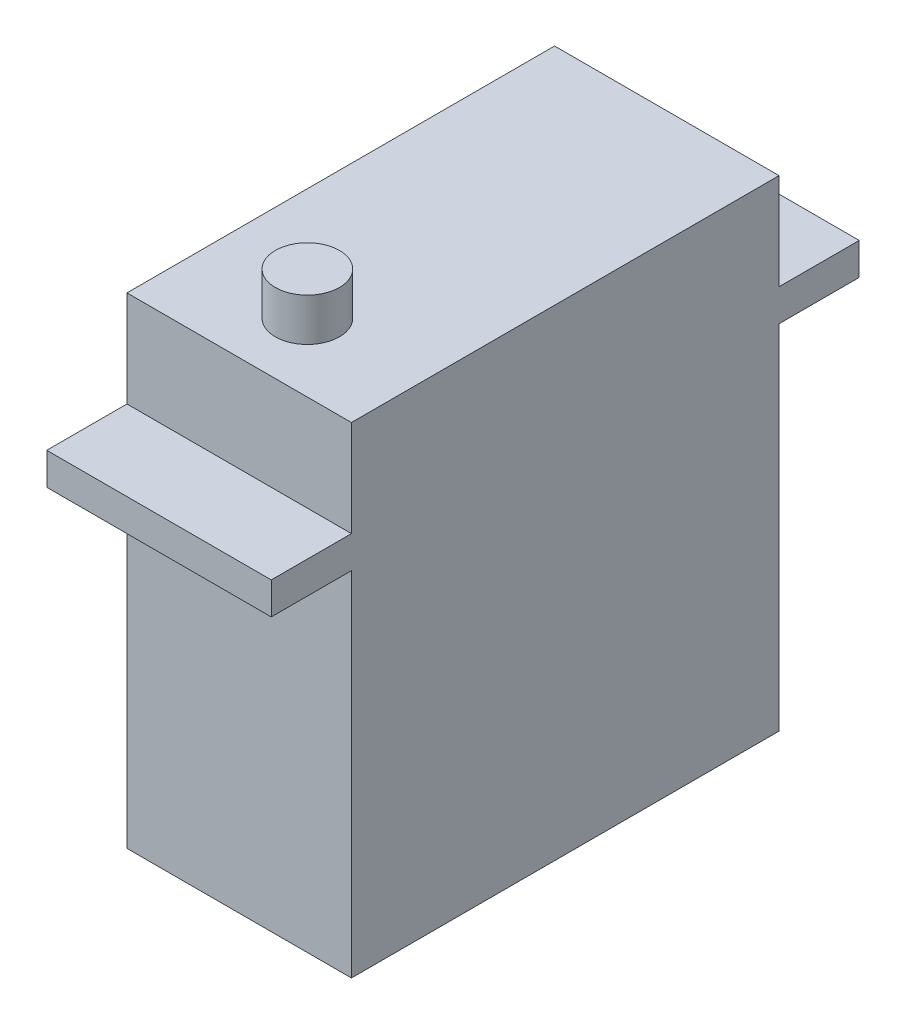
ISO-10303-21;
HEADER;
FILE_DESCRIPTION(('STEP AP214'),'2;1');
FILE_NAME('part.step','',(''),(''),'','','');
FILE_SCHEMA(('AUTOMOTIVE_DESIGN { 1 0 10303 214 1 1 1 1 }'));
ENDSEC;
DATA;
#1=APPLICATION_CONTEXT('core data for automotive mechanical design processes');
#2=APPLICATION_PROTOCOL_DEFINITION('international standard','automotive_design',2000,#1);
#3=PRODUCT_CONTEXT('',#1,'mechanical');
#4=PRODUCT('Part','Part','',(#3));
#5=PRODUCT_RELATED_PRODUCT_CATEGORY('part','',(#4));
#6=PRODUCT_DEFINITION_FORMATION('','',#4);
#7=PRODUCT_DEFINITION_CONTEXT('part definition',#1,'design');
#8=PRODUCT_DEFINITION('design','',#6,#7);
#9=PRODUCT_DEFINITION_SHAPE('','',#8);
#10=(LENGTH_UNIT() NAMED_UNIT(*) SI_UNIT(.MILLI.,.METRE.));
#11=(NAMED_UNIT(*) PLANE_ANGLE_UNIT() SI_UNIT($,.RADIAN.));
#12=(NAMED_UNIT(*) SI_UNIT($,.STERADIAN.) SOLID_ANGLE_UNIT());
#13=UNCERTAINTY_MEASURE_WITH_UNIT(LENGTH_MEASURE(1.E-05),#10,'distance_accuracy_value','');
#14=(GEOMETRIC_REPRESENTATION_CONTEXT(3) GLOBAL_UNCERTAINTY_ASSIGNED_CONTEXT((#13)) GLOBAL_UNIT_ASSIGNED_CONTEXT((#10,
#11,#12)) REPRESENTATION_CONTEXT('',''));
#15=CARTESIAN_POINT('',(0.,0.,0.));
#16=DIRECTION('',(0.,0.,1.));
#17=DIRECTION('',(1.,0.,0.));
#18=AXIS2_PLACEMENT_3D('',#15,#16,#17);
#19=CARTESIAN_POINT('',(-10.5,45.,-20.));
#20=DIRECTION('',(0.,0.,1.));
#21=DIRECTION('',(1.,0.,0.));
#22=AXIS2_PLACEMENT_3D('',#19,#20,#21);
#23=PLANE('',#22);
#24=DIRECTION('',(1.,0.,0.));
#25=VECTOR('',#24,1.);
#26=CARTESIAN_POINT('',(10.5,36.,-20.));
#27=LINE('',#26,#25);
#28=CARTESIAN_POINT('',(-10.5,36.,-20.));
#29=VERTEX_POINT('',#28);
#30=CARTESIAN_POINT('',(10.5,36.,-20.));
#31=VERTEX_POINT('',#30);
#32=EDGE_CURVE('E147',#29,#31,#27,.T.);
#33=ORIENTED_EDGE('',*,*,#32,.F.);
#34=DIRECTION('',(0.,-1.,0.));
#35=VECTOR('',#34,1.);
#36=CARTESIAN_POINT('',(-10.5,45.,-20.));
#37=LINE('',#36,#35);
#38=CARTESIAN_POINT('',(-10.5,45.,-20.));
#39=VERTEX_POINT('',#38);
#40=EDGE_CURVE('E211',#39,#29,#37,.T.);
#41=ORIENTED_EDGE('',*,*,#40,.F.);
#42=DIRECTION('',(-1.,0.,0.));
#43=VECTOR('',#42,1.);
#44=CARTESIAN_POINT('',(-10.5,45.,-20.));
#45=LINE('',#44,#43);
#46=CARTESIAN_POINT('',(10.5,45.,-20.));
#47=VERTEX_POINT('',#46);
#48=EDGE_CURVE('E187',#47,#39,#45,.T.);
#49=ORIENTED_EDGE('',*,*,#48,.F.);
#50=DIRECTION('',(0.,-1.,0.));
#51=VECTOR('',#50,1.);
#52=CARTESIAN_POINT('',(10.5,45.,-20.));
#53=LINE('',#52,#51);
#54=EDGE_CURVE('E48',#47,#31,#53,.T.);
#55=ORIENTED_EDGE('',*,*,#54,.T.);
#56=EDGE_LOOP('',(#33,#41,#49,#55));
#57=FACE_BOUND('',#56,.T.);
#58=ADVANCED_FACE('F40',(#57),#23,.F.);
#59=DIRECTION('',(-1.,0.,0.));
#60=VECTOR('',#59,1.);
#61=CARTESIAN_POINT('',(10.5,33.,-20.));
#62=LINE('',#61,#60);
#63=CARTESIAN_POINT('',(10.5,33.,-20.));
#64=VERTEX_POINT('',#63);
#65=CARTESIAN_POINT('',(-10.5,33.,-20.));
#66=VERTEX_POINT('',#65);
#67=EDGE_CURVE('E55',#64,#66,#62,.T.);
#68=ORIENTED_EDGE('',*,*,#67,.F.);
#69=CARTESIAN_POINT('',(10.5,0.,-20.));
#70=VERTEX_POINT('',#69);
#71=EDGE_CURVE('E150',#64,#70,#53,.T.);
#72=ORIENTED_EDGE('',*,*,#71,.T.);
#73=DIRECTION('',(-1.,0.,0.));
#74=VECTOR('',#73,1.);
#75=CARTESIAN_POINT('',(-10.5,0.,-20.));
#76=LINE('',#75,#74);
#77=CARTESIAN_POINT('',(-10.5,0.,-20.));
#78=VERTEX_POINT('',#77);
#79=EDGE_CURVE('E196',#70,#78,#76,.T.);
#80=ORIENTED_EDGE('',*,*,#79,.T.);
#81=EDGE_CURVE('E210',#66,#78,#37,.T.);
#82=ORIENTED_EDGE('',*,*,#81,.F.);
#83=EDGE_LOOP('',(#68,#72,#80,#82));
#84=FACE_BOUND('',#83,.T.);
#85=ADVANCED_FACE('F214',(#84),#23,.F.);
#86=CARTESIAN_POINT('',(-10.5,45.,20.));
#87=DIRECTION('',(0.,0.,-1.));
#88=DIRECTION('',(-1.,0.,0.));
#89=AXIS2_PLACEMENT_3D('',#86,#87,#88);
#90=PLANE('',#89);
#91=DIRECTION('',(-1.,0.,0.));
#92=VECTOR('',#91,1.);
#93=CARTESIAN_POINT('',(-10.5,36.,20.));
#94=LINE('',#93,#92);
#95=CARTESIAN_POINT('',(10.5,36.,20.));
#96=VERTEX_POINT('',#95);
#97=CARTESIAN_POINT('',(-10.5,36.,20.));
#98=VERTEX_POINT('',#97);
#99=EDGE_CURVE('E154',#96,#98,#94,.T.);
#100=ORIENTED_EDGE('',*,*,#99,.F.);
#101=DIRECTION('',(0.,-1.,0.));
#102=VECTOR('',#101,1.);
#103=CARTESIAN_POINT('',(10.5,45.,20.));
#104=LINE('',#103,#102);
#105=CARTESIAN_POINT('',(10.5,45.,20.));
#106=VERTEX_POINT('',#105);
#107=EDGE_CURVE('E204',#106,#96,#104,.T.);
#108=ORIENTED_EDGE('',*,*,#107,.F.);
#109=DIRECTION('',(1.,0.,0.));
#110=VECTOR('',#109,1.);
#111=CARTESIAN_POINT('',(-10.5,45.,20.));
#112=LINE('',#111,#110);
#113=CARTESIAN_POINT('',(-10.5,45.,20.));
#114=VERTEX_POINT('',#113);
#115=EDGE_CURVE('E192',#114,#106,#112,.T.);
#116=ORIENTED_EDGE('',*,*,#115,.F.);
#117=DIRECTION('',(0.,-1.,0.));
#118=VECTOR('',#117,1.);
#119=CARTESIAN_POINT('',(-10.5,45.,20.));
#120=LINE('',#119,#118);
#121=EDGE_CURVE('E208',#114,#98,#120,.T.);
#122=ORIENTED_EDGE('',*,*,#121,.T.);
#123=EDGE_LOOP('',(#100,#108,#116,#122));
#124=FACE_BOUND('',#123,.T.);
#125=ADVANCED_FACE('F260',(#124),#90,.F.);
#126=DIRECTION('',(1.,0.,0.));
#127=VECTOR('',#126,1.);
#128=CARTESIAN_POINT('',(-10.5,33.,20.));
#129=LINE('',#128,#127);
#130=CARTESIAN_POINT('',(-10.5,33.,20.));
#131=VERTEX_POINT('',#130);
#132=CARTESIAN_POINT('',(10.5,33.,20.));
#133=VERTEX_POINT('',#132);
#134=EDGE_CURVE('E151',#131,#133,#129,.T.);
#135=ORIENTED_EDGE('',*,*,#134,.F.);
#136=CARTESIAN_POINT('',(-10.5,0.,20.));
#137=VERTEX_POINT('',#136);
#138=EDGE_CURVE('E207',#131,#137,#120,.T.);
#139=ORIENTED_EDGE('',*,*,#138,.T.);
#140=DIRECTION('',(1.,0.,0.));
#141=VECTOR('',#140,1.);
#142=CARTESIAN_POINT('',(-10.5,0.,20.));
#143=LINE('',#142,#141);
#144=CARTESIAN_POINT('',(10.5,0.,20.));
#145=VERTEX_POINT('',#144);
#146=EDGE_CURVE('E188',#137,#145,#143,.T.);
#147=ORIENTED_EDGE('',*,*,#146,.T.);
#148=EDGE_CURVE('E194',#133,#145,#104,.T.);
#149=ORIENTED_EDGE('',*,*,#148,.F.);
#150=EDGE_LOOP('',(#135,#139,#147,#149));
#151=FACE_BOUND('',#150,.T.);
#152=ADVANCED_FACE('F223',(#151),#90,.F.);
#153=CARTESIAN_POINT('',(10.5,45.,20.));
#154=DIRECTION('',(-1.,0.,0.));
#155=DIRECTION('',(0.,0.,1.));
#156=AXIS2_PLACEMENT_3D('',#153,#154,#155);
#157=PLANE('',#156);
#158=DIRECTION('',(0.,0.,-1.));
#159=VECTOR('',#158,1.);
#160=CARTESIAN_POINT('',(10.5,0.,20.));
#161=LINE('',#160,#159);
#162=EDGE_CURVE('E183',#145,#70,#161,.T.);
#163=ORIENTED_EDGE('',*,*,#162,.T.);
#164=ORIENTED_EDGE('',*,*,#71,.F.);
#165=DIRECTION('',(0.,0.,1.));
#166=VECTOR('',#165,1.);
#167=CARTESIAN_POINT('',(10.5,33.,-27.5));
#168=LINE('',#167,#166);
#169=CARTESIAN_POINT('',(10.5,33.,-27.5));
#170=VERTEX_POINT('',#169);
#171=EDGE_CURVE('E132',#170,#64,#168,.T.);
#172=ORIENTED_EDGE('',*,*,#171,.F.);
#173=DIRECTION('',(0.,-1.,0.));
#174=VECTOR('',#173,1.);
#175=CARTESIAN_POINT('',(10.5,36.,-27.5));
#176=LINE('',#175,#174);
#177=CARTESIAN_POINT('',(10.5,36.,-27.5));
#178=VERTEX_POINT('',#177);
#179=EDGE_CURVE('E138',#178,#170,#176,.T.);
#180=ORIENTED_EDGE('',*,*,#179,.F.);
#181=DIRECTION('',(0.,0.,1.));
#182=VECTOR('',#181,1.);
#183=CARTESIAN_POINT('',(10.5,36.,-27.5));
#184=LINE('',#183,#182);
#185=EDGE_CURVE('E236',#178,#31,#184,.T.);
#186=ORIENTED_EDGE('',*,*,#185,.T.);
#187=ORIENTED_EDGE('',*,*,#54,.F.);
#188=DIRECTION('',(0.,0.,-1.));
#189=VECTOR('',#188,1.);
#190=CARTESIAN_POINT('',(10.5,45.,20.));
#191=LINE('',#190,#189);
#192=EDGE_CURVE('E184',#106,#47,#191,.T.);
#193=ORIENTED_EDGE('',*,*,#192,.F.);
#194=ORIENTED_EDGE('',*,*,#107,.T.);
#195=DIRECTION('',(0.,0.,-1.));
#196=VECTOR('',#195,1.);
#197=CARTESIAN_POINT('',(10.5,36.,27.5));
#198=LINE('',#197,#196);
#199=CARTESIAN_POINT('',(10.5,36.,27.5));
#200=VERTEX_POINT('',#199);
#201=EDGE_CURVE('E174',#200,#96,#198,.T.);
#202=ORIENTED_EDGE('',*,*,#201,.F.);
#203=DIRECTION('',(0.,1.,0.));
#204=VECTOR('',#203,1.);
#205=CARTESIAN_POINT('',(10.5,36.,27.5));
#206=LINE('',#205,#204);
#207=CARTESIAN_POINT('',(10.5,33.,27.5));
#208=VERTEX_POINT('',#207);
#209=EDGE_CURVE('E165',#208,#200,#206,.T.);
#210=ORIENTED_EDGE('',*,*,#209,.F.);
#211=DIRECTION('',(0.,0.,-1.));
#212=VECTOR('',#211,1.);
#213=CARTESIAN_POINT('',(10.5,33.,27.5));
#214=LINE('',#213,#212);
#215=EDGE_CURVE('E177',#208,#133,#214,.T.);
#216=ORIENTED_EDGE('',*,*,#215,.T.);
#217=ORIENTED_EDGE('',*,*,#148,.T.);
#218=EDGE_LOOP('',(#163,#164,#172,#180,#186,#187,#193,#194,#202,#210,#216,#217));
#219=FACE_BOUND('',#218,.T.);
#220=ADVANCED_FACE('F42',(#219),#157,.F.);
#221=CARTESIAN_POINT('',(-10.5,45.,20.));
#222=DIRECTION('',(1.,0.,0.));
#223=DIRECTION('',(0.,0.,-1.));
#224=AXIS2_PLACEMENT_3D('',#221,#222,#223);
#225=PLANE('',#224);
#226=DIRECTION('',(0.,0.,1.));
#227=VECTOR('',#226,1.);
#228=CARTESIAN_POINT('',(-10.5,0.,20.));
#229=LINE('',#228,#227);
#230=EDGE_CURVE('E199',#78,#137,#229,.T.);
#231=ORIENTED_EDGE('',*,*,#230,.T.);
#232=ORIENTED_EDGE('',*,*,#138,.F.);
#233=DIRECTION('',(0.,0.,-1.));
#234=VECTOR('',#233,1.);
#235=CARTESIAN_POINT('',(-10.5,33.,27.5));
#236=LINE('',#235,#234);
#237=CARTESIAN_POINT('',(-10.5,33.,27.5));
#238=VERTEX_POINT('',#237);
#239=EDGE_CURVE('E180',#238,#131,#236,.T.);
#240=ORIENTED_EDGE('',*,*,#239,.F.);
#241=DIRECTION('',(0.,-1.,0.));
#242=VECTOR('',#241,1.);
#243=CARTESIAN_POINT('',(-10.5,36.,27.5));
#244=LINE('',#243,#242);
#245=CARTESIAN_POINT('',(-10.5,36.,27.5));
#246=VERTEX_POINT('',#245);
#247=EDGE_CURVE('E160',#246,#238,#244,.T.);
#248=ORIENTED_EDGE('',*,*,#247,.F.);
#249=DIRECTION('',(0.,0.,-1.));
#250=VECTOR('',#249,1.);
#251=CARTESIAN_POINT('',(-10.5,36.,27.5));
#252=LINE('',#251,#250);
#253=EDGE_CURVE('E168',#246,#98,#252,.T.);
#254=ORIENTED_EDGE('',*,*,#253,.T.);
#255=ORIENTED_EDGE('',*,*,#121,.F.);
#256=DIRECTION('',(0.,0.,1.));
#257=VECTOR('',#256,1.);
#258=CARTESIAN_POINT('',(-10.5,45.,20.));
#259=LINE('',#258,#257);
#260=EDGE_CURVE('E190',#39,#114,#259,.T.);
#261=ORIENTED_EDGE('',*,*,#260,.F.);
#262=ORIENTED_EDGE('',*,*,#40,.T.);
#263=DIRECTION('',(0.,0.,1.));
#264=VECTOR('',#263,1.);
#265=CARTESIAN_POINT('',(-10.5,36.,-27.5));
#266=LINE('',#265,#264);
#267=CARTESIAN_POINT('',(-10.5,36.,-27.5));
#268=VERTEX_POINT('',#267);
#269=EDGE_CURVE('E156',#268,#29,#266,.T.);
#270=ORIENTED_EDGE('',*,*,#269,.F.);
#271=DIRECTION('',(0.,1.,0.));
#272=VECTOR('',#271,1.);
#273=CARTESIAN_POINT('',(-10.5,36.,-27.5));
#274=LINE('',#273,#272);
#275=CARTESIAN_POINT('',(-10.5,33.,-27.5));
#276=VERTEX_POINT('',#275);
#277=EDGE_CURVE('E137',#276,#268,#274,.T.);
#278=ORIENTED_EDGE('',*,*,#277,.F.);
#279=DIRECTION('',(0.,0.,1.));
#280=VECTOR('',#279,1.);
#281=CARTESIAN_POINT('',(-10.5,33.,-27.5));
#282=LINE('',#281,#280);
#283=EDGE_CURVE('E134',#276,#66,#282,.T.);
#284=ORIENTED_EDGE('',*,*,#283,.T.);
#285=ORIENTED_EDGE('',*,*,#81,.T.);
#286=EDGE_LOOP('',(#231,#232,#240,#248,#254,#255,#261,#262,#270,#278,#284,#285));
#287=FACE_BOUND('',#286,.T.);
#288=ADVANCED_FACE('F227',(#287),#225,.F.);
#289=CARTESIAN_POINT('',(0.,45.,0.));
#290=DIRECTION('',(0.,-1.,0.));
#291=DIRECTION('',(0.,0.,-1.));
#292=AXIS2_PLACEMENT_3D('',#289,#290,#291);
#293=PLANE('',#292);
#294=CARTESIAN_POINT('',(0.,45.,13.6201586042741));
#295=DIRECTION('',(0.,-1.,0.));
#296=DIRECTION('',(0.,0.,-1.));
#297=AXIS2_PLACEMENT_3D('',#294,#295,#296);
#298=CIRCLE('',#297,3.);
#299=CARTESIAN_POINT('',(0.,45.,10.6201586042741));
#300=VERTEX_POINT('',#299);
#301=EDGE_CURVE('E11',#300,#300,#298,.F.);
#302=ORIENTED_EDGE('',*,*,#301,.F.);
#303=EDGE_LOOP('',(#302));
#304=FACE_BOUND('',#303,.T.);
#305=ORIENTED_EDGE('',*,*,#192,.T.);
#306=ORIENTED_EDGE('',*,*,#48,.T.);
#307=ORIENTED_EDGE('',*,*,#260,.T.);
#308=ORIENTED_EDGE('',*,*,#115,.T.);
#309=EDGE_LOOP('',(#305,#306,#307,#308));
#310=FACE_BOUND('',#309,.T.);
#311=ADVANCED_FACE('F246',(#304,#310),#293,.F.);
#312=CARTESIAN_POINT('',(0.,0.,0.));
#313=DIRECTION('',(0.,-1.,0.));
#314=DIRECTION('',(0.,0.,-1.));
#315=AXIS2_PLACEMENT_3D('',#312,#313,#314);
#316=PLANE('',#315);
#317=ORIENTED_EDGE('',*,*,#162,.F.);
#318=ORIENTED_EDGE('',*,*,#146,.F.);
#319=ORIENTED_EDGE('',*,*,#230,.F.);
#320=ORIENTED_EDGE('',*,*,#79,.F.);
#321=EDGE_LOOP('',(#317,#318,#319,#320));
#322=FACE_BOUND('',#321,.T.);
#323=ADVANCED_FACE('F218',(#322),#316,.T.);
#324=CARTESIAN_POINT('',(-10.5,33.,27.5));
#325=DIRECTION('',(0.,1.,0.));
#326=DIRECTION('',(0.,0.,1.));
#327=AXIS2_PLACEMENT_3D('',#324,#325,#326);
#328=PLANE('',#327);
#329=ORIENTED_EDGE('',*,*,#134,.T.);
#330=ORIENTED_EDGE('',*,*,#215,.F.);
#331=DIRECTION('',(1.,0.,0.));
#332=VECTOR('',#331,1.);
#333=CARTESIAN_POINT('',(-10.5,33.,27.5));
#334=LINE('',#333,#332);
#335=EDGE_CURVE('E163',#238,#208,#334,.T.);
#336=ORIENTED_EDGE('',*,*,#335,.F.);
#337=ORIENTED_EDGE('',*,*,#239,.T.);
#338=EDGE_LOOP('',(#329,#330,#336,#337));
#339=FACE_BOUND('',#338,.T.);
#340=ADVANCED_FACE('F259',(#339),#328,.F.);
#341=CARTESIAN_POINT('',(-10.5,36.,27.5));
#342=DIRECTION('',(0.,-1.,0.));
#343=DIRECTION('',(0.,0.,-1.));
#344=AXIS2_PLACEMENT_3D('',#341,#342,#343);
#345=PLANE('',#344);
#346=ORIENTED_EDGE('',*,*,#99,.T.);
#347=ORIENTED_EDGE('',*,*,#253,.F.);
#348=DIRECTION('',(-1.,0.,0.));
#349=VECTOR('',#348,1.);
#350=CARTESIAN_POINT('',(-10.5,36.,27.5));
#351=LINE('',#350,#349);
#352=EDGE_CURVE('E167',#200,#246,#351,.T.);
#353=ORIENTED_EDGE('',*,*,#352,.F.);
#354=ORIENTED_EDGE('',*,*,#201,.T.);
#355=EDGE_LOOP('',(#346,#347,#353,#354));
#356=FACE_BOUND('',#355,.T.);
#357=ADVANCED_FACE('F253',(#356),#345,.F.);
#358=CARTESIAN_POINT('',(0.,0.,27.5));
#359=DIRECTION('',(0.,0.,1.));
#360=DIRECTION('',(1.,0.,0.));
#361=AXIS2_PLACEMENT_3D('',#358,#359,#360);
#362=PLANE('',#361);
#363=ORIENTED_EDGE('',*,*,#247,.T.);
#364=ORIENTED_EDGE('',*,*,#335,.T.);
#365=ORIENTED_EDGE('',*,*,#209,.T.);
#366=ORIENTED_EDGE('',*,*,#352,.T.);
#367=EDGE_LOOP('',(#363,#364,#365,#366));
#368=FACE_BOUND('',#367,.T.);
#369=ADVANCED_FACE('F257',(#368),#362,.T.);
#370=CARTESIAN_POINT('',(10.5,33.,-27.5));
#371=DIRECTION('',(0.,1.,0.));
#372=DIRECTION('',(0.,0.,1.));
#373=AXIS2_PLACEMENT_3D('',#370,#371,#372);
#374=PLANE('',#373);
#375=ORIENTED_EDGE('',*,*,#67,.T.);
#376=ORIENTED_EDGE('',*,*,#283,.F.);
#377=DIRECTION('',(-1.,0.,0.));
#378=VECTOR('',#377,1.);
#379=CARTESIAN_POINT('',(10.5,33.,-27.5));
#380=LINE('',#379,#378);
#381=EDGE_CURVE('E128',#170,#276,#380,.T.);
#382=ORIENTED_EDGE('',*,*,#381,.F.);
#383=ORIENTED_EDGE('',*,*,#171,.T.);
#384=EDGE_LOOP('',(#375,#376,#382,#383));
#385=FACE_BOUND('',#384,.T.);
#386=ADVANCED_FACE('F130',(#385),#374,.F.);
#387=CARTESIAN_POINT('',(10.5,36.,-27.5));
#388=DIRECTION('',(0.,-1.,0.));
#389=DIRECTION('',(0.,0.,-1.));
#390=AXIS2_PLACEMENT_3D('',#387,#388,#389);
#391=PLANE('',#390);
#392=ORIENTED_EDGE('',*,*,#32,.T.);
#393=ORIENTED_EDGE('',*,*,#185,.F.);
#394=DIRECTION('',(1.,0.,0.));
#395=VECTOR('',#394,1.);
#396=CARTESIAN_POINT('',(10.5,36.,-27.5));
#397=LINE('',#396,#395);
#398=EDGE_CURVE('E143',#268,#178,#397,.T.);
#399=ORIENTED_EDGE('',*,*,#398,.F.);
#400=ORIENTED_EDGE('',*,*,#269,.T.);
#401=EDGE_LOOP('',(#392,#393,#399,#400));
#402=FACE_BOUND('',#401,.T.);
#403=ADVANCED_FACE('F240',(#402),#391,.F.);
#404=CARTESIAN_POINT('',(0.,0.,-27.5));
#405=DIRECTION('',(0.,0.,-1.));
#406=DIRECTION('',(-1.,0.,0.));
#407=AXIS2_PLACEMENT_3D('',#404,#405,#406);
#408=PLANE('',#407);
#409=ORIENTED_EDGE('',*,*,#179,.T.);
#410=ORIENTED_EDGE('',*,*,#381,.T.);
#411=ORIENTED_EDGE('',*,*,#277,.T.);
#412=ORIENTED_EDGE('',*,*,#398,.T.);
#413=EDGE_LOOP('',(#409,#410,#411,#412));
#414=FACE_BOUND('',#413,.T.);
#415=ADVANCED_FACE('F141',(#414),#408,.T.);
#416=CARTESIAN_POINT('',(0.,49.,13.6201586042741));
#417=DIRECTION('',(0.,-1.,0.));
#418=DIRECTION('',(0.,0.,-1.));
#419=AXIS2_PLACEMENT_3D('',#416,#417,#418);
#420=CYLINDRICAL_SURFACE('',#419,3.);
#421=CARTESIAN_POINT('',(0.,49.,13.6201586042741));
#422=DIRECTION('',(0.,1.,0.));
#423=DIRECTION('',(0.,0.,1.));
#424=AXIS2_PLACEMENT_3D('',#421,#422,#423);
#425=CIRCLE('',#424,3.);
#426=CARTESIAN_POINT('',(0.,49.,16.6201586042741));
#427=VERTEX_POINT('',#426);
#428=EDGE_CURVE('E228',#427,#427,#425,.T.);
#429=ORIENTED_EDGE('',*,*,#428,.F.);
#430=EDGE_LOOP('',(#429));
#431=FACE_BOUND('',#430,.T.);
#432=ORIENTED_EDGE('',*,*,#301,.T.);
#433=EDGE_LOOP('',(#432));
#434=FACE_BOUND('',#433,.T.);
#435=ADVANCED_FACE('F369',(#431,#434),#420,.T.);
#436=CARTESIAN_POINT('',(0.,49.,13.6201586042741));
#437=DIRECTION('',(0.,1.,0.));
#438=DIRECTION('',(0.,0.,1.));
#439=AXIS2_PLACEMENT_3D('',#436,#437,#438);
#440=PLANE('',#439);
#441=ORIENTED_EDGE('',*,*,#428,.T.);
#442=EDGE_LOOP('',(#441));
#443=FACE_BOUND('',#442,.T.);
#444=ADVANCED_FACE('F385',(#443),#440,.T.);
#445=CLOSED_SHELL('',(#58,#85,#125,#152,#220,#288,#311,#323,#340,#357,#369,#386,#403,#415,#435,#444));
#446=MANIFOLD_SOLID_BREP('B2',#445);
#447=ADVANCED_BREP_SHAPE_REPRESENTATION('',(#18,#446),#14);
#448=SHAPE_DEFINITION_REPRESENTATION(#9,#447);
ENDSEC;
END-ISO-10303-21;
